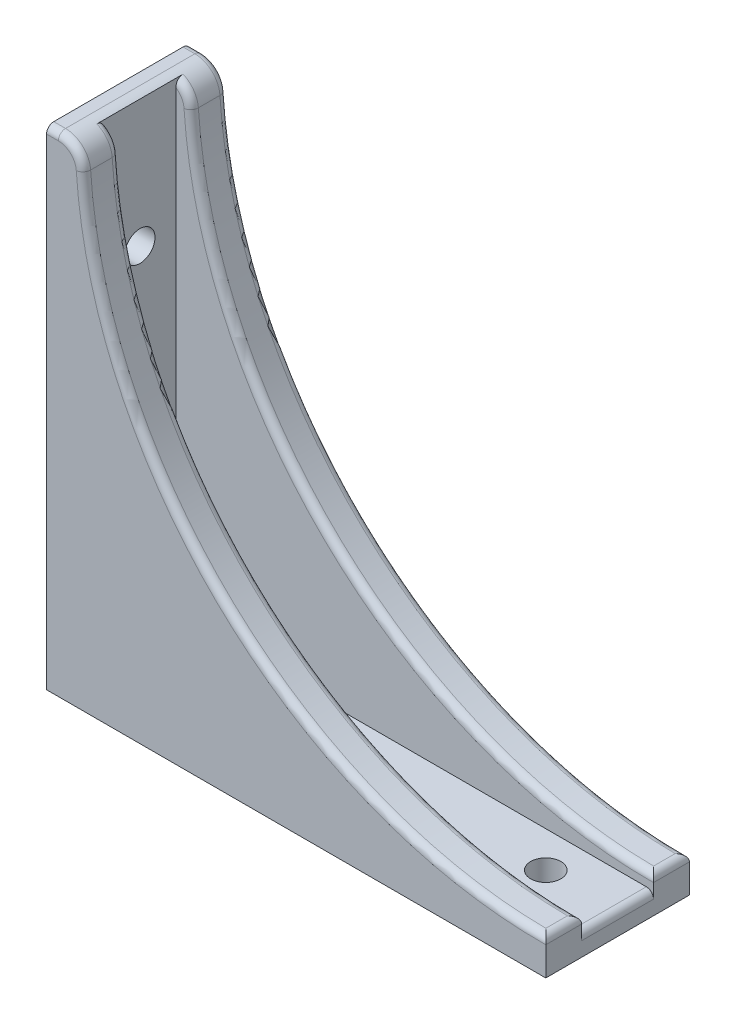
ISO-10303-21;
HEADER;
FILE_DESCRIPTION(('STEP AP214'),'2;1');
FILE_NAME('part.step','',(''),(''),'','','');
FILE_SCHEMA(('AUTOMOTIVE_DESIGN { 1 0 10303 214 1 1 1 1 }'));
ENDSEC;
DATA;
#1=APPLICATION_CONTEXT('core data for automotive mechanical design processes');
#2=APPLICATION_PROTOCOL_DEFINITION('international standard','automotive_design',2000,#1);
#3=PRODUCT_CONTEXT('',#1,'mechanical');
#4=PRODUCT('Part','Part','',(#3));
#5=PRODUCT_RELATED_PRODUCT_CATEGORY('part','',(#4));
#6=PRODUCT_DEFINITION_FORMATION('','',#4);
#7=PRODUCT_DEFINITION_CONTEXT('part definition',#1,'design');
#8=PRODUCT_DEFINITION('design','',#6,#7);
#9=PRODUCT_DEFINITION_SHAPE('','',#8);
#10=(LENGTH_UNIT() NAMED_UNIT(*) SI_UNIT(.MILLI.,.METRE.));
#11=(NAMED_UNIT(*) PLANE_ANGLE_UNIT() SI_UNIT($,.RADIAN.));
#12=(NAMED_UNIT(*) SI_UNIT($,.STERADIAN.) SOLID_ANGLE_UNIT());
#13=UNCERTAINTY_MEASURE_WITH_UNIT(LENGTH_MEASURE(1.E-05),#10,'distance_accuracy_value','');
#14=(GEOMETRIC_REPRESENTATION_CONTEXT(3) GLOBAL_UNCERTAINTY_ASSIGNED_CONTEXT((#13)) GLOBAL_UNIT_ASSIGNED_CONTEXT((#10,
#11,#12)) REPRESENTATION_CONTEXT('',''));
#15=CARTESIAN_POINT('',(0.,0.,0.));
#16=DIRECTION('',(0.,0.,1.));
#17=DIRECTION('',(1.,0.,0.));
#18=AXIS2_PLACEMENT_3D('',#15,#16,#17);
#19=CARTESIAN_POINT('',(0.,68.,20.));
#20=DIRECTION('',(0.,1.,0.));
#21=DIRECTION('',(0.,0.,1.));
#22=AXIS2_PLACEMENT_3D('',#19,#20,#21);
#23=PLANE('',#22);
#24=DIRECTION('',(0.,0.,-1.));
#25=VECTOR('',#24,1.);
#26=CARTESIAN_POINT('',(1.64235406117368,68.,0.));
#27=LINE('',#26,#25);
#28=CARTESIAN_POINT('',(1.64235406117368,68.,19.));
#29=VERTEX_POINT('',#28);
#30=CARTESIAN_POINT('',(1.64235406117368,68.,1.));
#31=VERTEX_POINT('',#30);
#32=EDGE_CURVE('E247',#29,#31,#27,.T.);
#33=ORIENTED_EDGE('',*,*,#32,.T.);
#34=DIRECTION('',(1.,0.,0.));
#35=VECTOR('',#34,1.);
#36=CARTESIAN_POINT('',(0.,68.,1.));
#37=LINE('',#36,#35);
#38=CARTESIAN_POINT('',(0.,68.,1.));
#39=VERTEX_POINT('',#38);
#40=EDGE_CURVE('E291',#31,#39,#37,.F.);
#41=ORIENTED_EDGE('',*,*,#40,.T.);
#42=DIRECTION('',(0.,0.,-1.));
#43=VECTOR('',#42,1.);
#44=CARTESIAN_POINT('',(0.,68.,20.));
#45=LINE('',#44,#43);
#46=CARTESIAN_POINT('',(0.,68.,19.));
#47=VERTEX_POINT('',#46);
#48=EDGE_CURVE('E207',#47,#39,#45,.T.);
#49=ORIENTED_EDGE('',*,*,#48,.F.);
#50=DIRECTION('',(1.,0.,0.));
#51=VECTOR('',#50,1.);
#52=CARTESIAN_POINT('',(0.,68.,19.));
#53=LINE('',#52,#51);
#54=EDGE_CURVE('E287',#47,#29,#53,.T.);
#55=ORIENTED_EDGE('',*,*,#54,.T.);
#56=EDGE_LOOP('',(#33,#41,#49,#55));
#57=FACE_BOUND('',#56,.T.);
#58=ADVANCED_FACE('F45',(#57),#23,.T.);
#59=CARTESIAN_POINT('',(0.,0.,20.));
#60=DIRECTION('',(-1.,0.,0.));
#61=DIRECTION('',(0.,0.,1.));
#62=AXIS2_PLACEMENT_3D('',#59,#60,#61);
#63=PLANE('',#62);
#64=CARTESIAN_POINT('',(0.,25.,10.));
#65=DIRECTION('',(-1.,0.,0.));
#66=DIRECTION('',(0.,0.,1.));
#67=AXIS2_PLACEMENT_3D('',#64,#65,#66);
#68=CIRCLE('',#67,2.1);
#69=CARTESIAN_POINT('',(0.,25.,12.1));
#70=VERTEX_POINT('',#69);
#71=EDGE_CURVE('E830',#70,#70,#68,.T.);
#72=ORIENTED_EDGE('',*,*,#71,.F.);
#73=EDGE_LOOP('',(#72));
#74=FACE_BOUND('',#73,.T.);
#75=CARTESIAN_POINT('',(0.,50.,10.));
#76=DIRECTION('',(-1.,0.,0.));
#77=DIRECTION('',(0.,0.,1.));
#78=AXIS2_PLACEMENT_3D('',#75,#76,#77);
#79=CIRCLE('',#78,2.1);
#80=CARTESIAN_POINT('',(0.,50.,12.1));
#81=VERTEX_POINT('',#80);
#82=EDGE_CURVE('E844',#81,#81,#79,.T.);
#83=ORIENTED_EDGE('',*,*,#82,.F.);
#84=EDGE_LOOP('',(#83));
#85=FACE_BOUND('',#84,.T.);
#86=ORIENTED_EDGE('',*,*,#48,.T.);
#87=CARTESIAN_POINT('',(0.,67.,1.));
#88=DIRECTION('',(-1.,0.,0.));
#89=DIRECTION('',(0.,0.,1.));
#90=AXIS2_PLACEMENT_3D('',#87,#88,#89);
#91=CIRCLE('',#90,1.);
#92=CARTESIAN_POINT('',(0.,67.,0.));
#93=VERTEX_POINT('',#92);
#94=EDGE_CURVE('E297',#39,#93,#91,.T.);
#95=ORIENTED_EDGE('',*,*,#94,.T.);
#96=DIRECTION('',(0.,1.,0.));
#97=VECTOR('',#96,1.);
#98=CARTESIAN_POINT('',(0.,0.,0.));
#99=LINE('',#98,#97);
#100=CARTESIAN_POINT('',(0.,0.,0.));
#101=VERTEX_POINT('',#100);
#102=EDGE_CURVE('E203',#101,#93,#99,.T.);
#103=ORIENTED_EDGE('',*,*,#102,.F.);
#104=DIRECTION('',(0.,0.,-1.));
#105=VECTOR('',#104,1.);
#106=CARTESIAN_POINT('',(0.,0.,20.));
#107=LINE('',#106,#105);
#108=CARTESIAN_POINT('',(0.,0.,20.));
#109=VERTEX_POINT('',#108);
#110=EDGE_CURVE('E195',#109,#101,#107,.T.);
#111=ORIENTED_EDGE('',*,*,#110,.F.);
#112=DIRECTION('',(0.,1.,0.));
#113=VECTOR('',#112,1.);
#114=CARTESIAN_POINT('',(0.,0.,20.));
#115=LINE('',#114,#113);
#116=CARTESIAN_POINT('',(0.,67.,20.));
#117=VERTEX_POINT('',#116);
#118=EDGE_CURVE('E200',#109,#117,#115,.T.);
#119=ORIENTED_EDGE('',*,*,#118,.T.);
#120=CARTESIAN_POINT('',(0.,67.,19.));
#121=DIRECTION('',(-1.,0.,0.));
#122=DIRECTION('',(0.,0.,1.));
#123=AXIS2_PLACEMENT_3D('',#120,#121,#122);
#124=CIRCLE('',#123,1.);
#125=EDGE_CURVE('E294',#117,#47,#124,.T.);
#126=ORIENTED_EDGE('',*,*,#125,.T.);
#127=EDGE_LOOP('',(#86,#95,#103,#111,#119,#126));
#128=FACE_BOUND('',#127,.T.);
#129=ADVANCED_FACE('F198',(#74,#85,#128),#63,.T.);
#130=CARTESIAN_POINT('',(0.,0.,20.));
#131=DIRECTION('',(0.,1.,0.));
#132=DIRECTION('',(0.,0.,1.));
#133=AXIS2_PLACEMENT_3D('',#130,#131,#132);
#134=PLANE('',#133);
#135=CARTESIAN_POINT('',(59.5,0.,10.));
#136=DIRECTION('',(0.,-1.,0.));
#137=DIRECTION('',(0.,0.,-1.));
#138=AXIS2_PLACEMENT_3D('',#135,#136,#137);
#139=CIRCLE('',#138,2.1);
#140=CARTESIAN_POINT('',(59.5,0.,7.9));
#141=VERTEX_POINT('',#140);
#142=EDGE_CURVE('E820',#141,#141,#139,.T.);
#143=ORIENTED_EDGE('',*,*,#142,.F.);
#144=EDGE_LOOP('',(#143));
#145=FACE_BOUND('',#144,.T.);
#146=DIRECTION('',(1.,0.,0.));
#147=VECTOR('',#146,1.);
#148=CARTESIAN_POINT('',(0.,0.,0.));
#149=LINE('',#148,#147);
#150=CARTESIAN_POINT('',(69.5,0.,0.));
#151=VERTEX_POINT('',#150);
#152=EDGE_CURVE('E239',#101,#151,#149,.T.);
#153=ORIENTED_EDGE('',*,*,#152,.T.);
#154=DIRECTION('',(0.,0.,-1.));
#155=VECTOR('',#154,1.);
#156=CARTESIAN_POINT('',(69.5,0.,20.));
#157=LINE('',#156,#155);
#158=CARTESIAN_POINT('',(69.5,0.,20.));
#159=VERTEX_POINT('',#158);
#160=EDGE_CURVE('E208',#159,#151,#157,.T.);
#161=ORIENTED_EDGE('',*,*,#160,.F.);
#162=DIRECTION('',(1.,0.,0.));
#163=VECTOR('',#162,1.);
#164=CARTESIAN_POINT('',(0.,0.,20.));
#165=LINE('',#164,#163);
#166=EDGE_CURVE('E211',#109,#159,#165,.T.);
#167=ORIENTED_EDGE('',*,*,#166,.F.);
#168=ORIENTED_EDGE('',*,*,#110,.T.);
#169=EDGE_LOOP('',(#153,#161,#167,#168));
#170=FACE_BOUND('',#169,.T.);
#171=ADVANCED_FACE('F212',(#145,#170),#134,.F.);
#172=CARTESIAN_POINT('',(69.5,0.,20.));
#173=DIRECTION('',(-1.,0.,0.));
#174=DIRECTION('',(0.,0.,1.));
#175=AXIS2_PLACEMENT_3D('',#172,#173,#174);
#176=PLANE('',#175);
#177=DIRECTION('',(0.,1.,0.));
#178=VECTOR('',#177,1.);
#179=CARTESIAN_POINT('',(69.5,0.,0.));
#180=LINE('',#179,#178);
#181=CARTESIAN_POINT('',(69.5,4.00186347337111,0.));
#182=VERTEX_POINT('',#181);
#183=EDGE_CURVE('E224',#151,#182,#180,.T.);
#184=ORIENTED_EDGE('',*,*,#183,.T.);
#185=DIRECTION('',(0.,0.,1.));
#186=VECTOR('',#185,1.);
#187=CARTESIAN_POINT('',(69.5,4.00186347337111,20.));
#188=LINE('',#187,#186);
#189=CARTESIAN_POINT('',(69.5,4.00186347337111,5.));
#190=VERTEX_POINT('',#189);
#191=EDGE_CURVE('E349',#182,#190,#188,.T.);
#192=ORIENTED_EDGE('',*,*,#191,.T.);
#193=DIRECTION('',(0.,1.,0.));
#194=VECTOR('',#193,1.);
#195=CARTESIAN_POINT('',(69.5,0.,5.));
#196=LINE('',#195,#194);
#197=CARTESIAN_POINT('',(69.5,2.,5.));
#198=VERTEX_POINT('',#197);
#199=EDGE_CURVE('E592',#198,#190,#196,.T.);
#200=ORIENTED_EDGE('',*,*,#199,.F.);
#201=DIRECTION('',(0.,0.,-1.));
#202=VECTOR('',#201,1.);
#203=CARTESIAN_POINT('',(69.5,2.,20.));
#204=LINE('',#203,#202);
#205=CARTESIAN_POINT('',(69.5,2.,15.));
#206=VERTEX_POINT('',#205);
#207=EDGE_CURVE('E342',#198,#206,#204,.F.);
#208=ORIENTED_EDGE('',*,*,#207,.T.);
#209=DIRECTION('',(0.,1.,0.));
#210=VECTOR('',#209,1.);
#211=CARTESIAN_POINT('',(69.5,0.,15.));
#212=LINE('',#211,#210);
#213=CARTESIAN_POINT('',(69.5,4.00186347337111,15.));
#214=VERTEX_POINT('',#213);
#215=EDGE_CURVE('E231',#206,#214,#212,.T.);
#216=ORIENTED_EDGE('',*,*,#215,.T.);
#217=DIRECTION('',(0.,0.,1.));
#218=VECTOR('',#217,1.);
#219=CARTESIAN_POINT('',(69.5,4.00186347337111,20.));
#220=LINE('',#219,#218);
#221=CARTESIAN_POINT('',(69.5,4.00186347337111,20.));
#222=VERTEX_POINT('',#221);
#223=EDGE_CURVE('E346',#214,#222,#220,.T.);
#224=ORIENTED_EDGE('',*,*,#223,.T.);
#225=DIRECTION('',(0.,1.,0.));
#226=VECTOR('',#225,1.);
#227=CARTESIAN_POINT('',(69.5,0.,20.));
#228=LINE('',#227,#226);
#229=EDGE_CURVE('E234',#159,#222,#228,.T.);
#230=ORIENTED_EDGE('',*,*,#229,.F.);
#231=ORIENTED_EDGE('',*,*,#160,.T.);
#232=EDGE_LOOP('',(#184,#192,#200,#208,#216,#224,#230,#231));
#233=FACE_BOUND('',#232,.T.);
#234=ADVANCED_FACE('F401',(#233),#176,.F.);
#235=CARTESIAN_POINT('',(0.,0.,20.));
#236=DIRECTION('',(0.,0.,1.));
#237=DIRECTION('',(1.,0.,0.));
#238=AXIS2_PLACEMENT_3D('',#235,#236,#237);
#239=PLANE('',#238);
#240=CARTESIAN_POINT('',(1.64235406117368,64.5,20.));
#241=DIRECTION('',(0.,0.,1.));
#242=DIRECTION('',(1.,0.,0.));
#243=AXIS2_PLACEMENT_3D('',#240,#241,#242);
#244=CIRCLE('',#243,2.5);
#245=CARTESIAN_POINT('',(4.13679231902297,64.6666666666667,20.));
#246=VERTEX_POINT('',#245);
#247=CARTESIAN_POINT('',(1.64235406117368,67.,20.));
#248=VERTEX_POINT('',#247);
#249=EDGE_CURVE('E316',#246,#248,#244,.T.);
#250=ORIENTED_EDGE('',*,*,#249,.T.);
#251=DIRECTION('',(1.,0.,0.));
#252=VECTOR('',#251,1.);
#253=CARTESIAN_POINT('',(0.,67.,20.));
#254=LINE('',#253,#252);
#255=EDGE_CURVE('E222',#248,#117,#254,.F.);
#256=ORIENTED_EDGE('',*,*,#255,.T.);
#257=ORIENTED_EDGE('',*,*,#118,.F.);
#258=ORIENTED_EDGE('',*,*,#166,.T.);
#259=ORIENTED_EDGE('',*,*,#229,.T.);
#260=CARTESIAN_POINT('',(69.5,4.0019836765729,20.));
#261=VERTEX_POINT('',#260);
#262=EDGE_CURVE('E218',#222,#261,#228,.T.);
#263=ORIENTED_EDGE('',*,*,#262,.T.);
#264=CARTESIAN_POINT('',(68.9921870231046,69.,20.));
#265=DIRECTION('',(0.,0.,1.));
#266=DIRECTION('',(1.,0.,0.));
#267=AXIS2_PLACEMENT_3D('',#264,#265,#266);
#268=CIRCLE('',#267,65.);
#269=EDGE_CURVE('E313',#261,#246,#268,.F.);
#270=ORIENTED_EDGE('',*,*,#269,.T.);
#271=EDGE_LOOP('',(#250,#256,#257,#258,#259,#263,#270));
#272=FACE_BOUND('',#271,.T.);
#273=ADVANCED_FACE('F220',(#272),#239,.T.);
#274=CARTESIAN_POINT('',(0.,0.,0.));
#275=DIRECTION('',(0.,0.,1.));
#276=DIRECTION('',(1.,0.,0.));
#277=AXIS2_PLACEMENT_3D('',#274,#275,#276);
#278=PLANE('',#277);
#279=ORIENTED_EDGE('',*,*,#102,.T.);
#280=DIRECTION('',(1.,0.,0.));
#281=VECTOR('',#280,1.);
#282=CARTESIAN_POINT('',(1.64235406117368,67.,0.));
#283=LINE('',#282,#281);
#284=CARTESIAN_POINT('',(1.64235406117368,67.,0.));
#285=VERTEX_POINT('',#284);
#286=EDGE_CURVE('E283',#93,#285,#283,.T.);
#287=ORIENTED_EDGE('',*,*,#286,.T.);
#288=CARTESIAN_POINT('',(1.64235406117368,64.5,0.));
#289=DIRECTION('',(0.,0.,1.));
#290=DIRECTION('',(1.,0.,0.));
#291=AXIS2_PLACEMENT_3D('',#288,#289,#290);
#292=CIRCLE('',#291,2.5);
#293=CARTESIAN_POINT('',(4.13679231902297,64.6666666666667,0.));
#294=VERTEX_POINT('',#293);
#295=EDGE_CURVE('E280',#285,#294,#292,.F.);
#296=ORIENTED_EDGE('',*,*,#295,.T.);
#297=CARTESIAN_POINT('',(68.9921870231046,69.,0.));
#298=DIRECTION('',(0.,0.,1.));
#299=DIRECTION('',(1.,0.,0.));
#300=AXIS2_PLACEMENT_3D('',#297,#298,#299);
#301=CIRCLE('',#300,65.);
#302=CARTESIAN_POINT('',(69.5,4.0019836765729,0.));
#303=VERTEX_POINT('',#302);
#304=EDGE_CURVE('E277',#294,#303,#301,.T.);
#305=ORIENTED_EDGE('',*,*,#304,.T.);
#306=EDGE_CURVE('E228',#182,#303,#180,.T.);
#307=ORIENTED_EDGE('',*,*,#306,.F.);
#308=ORIENTED_EDGE('',*,*,#183,.F.);
#309=ORIENTED_EDGE('',*,*,#152,.F.);
#310=EDGE_LOOP('',(#279,#287,#296,#305,#307,#308,#309));
#311=FACE_BOUND('',#310,.T.);
#312=ADVANCED_FACE('F397',(#311),#278,.F.);
#313=CARTESIAN_POINT('',(0.,0.,15.));
#314=DIRECTION('',(0.,0.,1.));
#315=DIRECTION('',(1.,0.,0.));
#316=AXIS2_PLACEMENT_3D('',#313,#314,#315);
#317=PLANE('',#316);
#318=DIRECTION('',(0.,-1.,0.));
#319=VECTOR('',#318,1.);
#320=CARTESIAN_POINT('',(3.,0.,15.));
#321=LINE('',#320,#319);
#322=CARTESIAN_POINT('',(3.,66.5992373626602,15.));
#323=VERTEX_POINT('',#322);
#324=CARTESIAN_POINT('',(3.,6.5,15.));
#325=VERTEX_POINT('',#324);
#326=EDGE_CURVE('E587',#323,#325,#321,.T.);
#327=ORIENTED_EDGE('',*,*,#326,.F.);
#328=CARTESIAN_POINT('',(1.64235406117368,64.5,15.));
#329=DIRECTION('',(0.,0.,1.));
#330=DIRECTION('',(1.,0.,0.));
#331=AXIS2_PLACEMENT_3D('',#328,#329,#330);
#332=CIRCLE('',#331,2.5);
#333=CARTESIAN_POINT('',(4.13679231902297,64.6666666666667,15.));
#334=VERTEX_POINT('',#333);
#335=EDGE_CURVE('E324',#323,#334,#332,.F.);
#336=ORIENTED_EDGE('',*,*,#335,.T.);
#337=CARTESIAN_POINT('',(68.9921870231046,69.,15.));
#338=DIRECTION('',(0.,0.,1.));
#339=DIRECTION('',(1.,0.,0.));
#340=AXIS2_PLACEMENT_3D('',#337,#338,#339);
#341=CIRCLE('',#340,65.);
#342=CARTESIAN_POINT('',(69.5,4.0019836765729,15.));
#343=VERTEX_POINT('',#342);
#344=EDGE_CURVE('E321',#334,#343,#341,.T.);
#345=ORIENTED_EDGE('',*,*,#344,.T.);
#346=EDGE_CURVE('E591',#214,#343,#212,.T.);
#347=ORIENTED_EDGE('',*,*,#346,.F.);
#348=ORIENTED_EDGE('',*,*,#215,.F.);
#349=CARTESIAN_POINT('',(68.5,2.,15.));
#350=DIRECTION('',(0.,0.,1.));
#351=DIRECTION('',(1.,0.,0.));
#352=AXIS2_PLACEMENT_3D('',#349,#350,#351);
#353=CIRCLE('',#352,1.);
#354=CARTESIAN_POINT('',(68.5,3.,15.));
#355=VERTEX_POINT('',#354);
#356=EDGE_CURVE('E12',#206,#355,#353,.T.);
#357=ORIENTED_EDGE('',*,*,#356,.T.);
#358=DIRECTION('',(-1.,0.,0.));
#359=VECTOR('',#358,1.);
#360=CARTESIAN_POINT('',(0.,3.,15.));
#361=LINE('',#360,#359);
#362=CARTESIAN_POINT('',(6.5,3.,15.));
#363=VERTEX_POINT('',#362);
#364=EDGE_CURVE('E240',#355,#363,#361,.T.);
#365=ORIENTED_EDGE('',*,*,#364,.T.);
#366=CARTESIAN_POINT('',(6.5,6.5,15.));
#367=DIRECTION('',(0.,0.,1.));
#368=DIRECTION('',(1.,0.,0.));
#369=AXIS2_PLACEMENT_3D('',#366,#367,#368);
#370=CIRCLE('',#369,3.5);
#371=EDGE_CURVE('E266',#363,#325,#370,.F.);
#372=ORIENTED_EDGE('',*,*,#371,.T.);
#373=EDGE_LOOP('',(#327,#336,#345,#347,#348,#357,#365,#372));
#374=FACE_BOUND('',#373,.T.);
#375=ADVANCED_FACE('F393',(#374),#317,.F.);
#376=CARTESIAN_POINT('',(0.,3.,112.990590921878));
#377=DIRECTION('',(0.,-1.,0.));
#378=DIRECTION('',(1.,0.,0.));
#379=AXIS2_PLACEMENT_3D('',#376,#377,#378);
#380=PLANE('',#379);
#381=CARTESIAN_POINT('',(59.5,3.,10.));
#382=DIRECTION('',(0.,-1.,0.));
#383=DIRECTION('',(1.,0.,0.));
#384=AXIS2_PLACEMENT_3D('',#381,#382,#383);
#385=CIRCLE('',#384,2.1);
#386=CARTESIAN_POINT('',(61.6,3.,10.));
#387=VERTEX_POINT('',#386);
#388=EDGE_CURVE('E823',#387,#387,#385,.F.);
#389=ORIENTED_EDGE('',*,*,#388,.F.);
#390=EDGE_LOOP('',(#389));
#391=FACE_BOUND('',#390,.T.);
#392=ORIENTED_EDGE('',*,*,#364,.F.);
#393=DIRECTION('',(0.,0.,-1.));
#394=VECTOR('',#393,1.);
#395=CARTESIAN_POINT('',(68.5,3.,112.990590921878));
#396=LINE('',#395,#394);
#397=CARTESIAN_POINT('',(68.5,3.,5.));
#398=VERTEX_POINT('',#397);
#399=EDGE_CURVE('E359',#355,#398,#396,.T.);
#400=ORIENTED_EDGE('',*,*,#399,.T.);
#401=DIRECTION('',(-1.,0.,0.));
#402=VECTOR('',#401,1.);
#403=CARTESIAN_POINT('',(0.,3.,5.));
#404=LINE('',#403,#402);
#405=CARTESIAN_POINT('',(6.5,3.,5.));
#406=VERTEX_POINT('',#405);
#407=EDGE_CURVE('E828',#398,#406,#404,.T.);
#408=ORIENTED_EDGE('',*,*,#407,.T.);
#409=DIRECTION('',(0.,0.,-1.));
#410=VECTOR('',#409,1.);
#411=CARTESIAN_POINT('',(6.5,3.,112.990590921878));
#412=LINE('',#411,#410);
#413=EDGE_CURVE('E273',#406,#363,#412,.F.);
#414=ORIENTED_EDGE('',*,*,#413,.T.);
#415=EDGE_LOOP('',(#392,#400,#408,#414));
#416=FACE_BOUND('',#415,.T.);
#417=ADVANCED_FACE('F387',(#391,#416),#380,.F.);
#418=CARTESIAN_POINT('',(3.,0.,112.990590921878));
#419=DIRECTION('',(1.,0.,0.));
#420=DIRECTION('',(0.,1.,0.));
#421=AXIS2_PLACEMENT_3D('',#418,#419,#420);
#422=PLANE('',#421);
#423=CARTESIAN_POINT('',(3.,25.,10.));
#424=DIRECTION('',(1.,0.,0.));
#425=DIRECTION('',(0.,1.,0.));
#426=AXIS2_PLACEMENT_3D('',#423,#424,#425);
#427=CIRCLE('',#426,2.1);
#428=CARTESIAN_POINT('',(3.,27.1,10.));
#429=VERTEX_POINT('',#428);
#430=EDGE_CURVE('E847',#429,#429,#427,.F.);
#431=ORIENTED_EDGE('',*,*,#430,.T.);
#432=EDGE_LOOP('',(#431));
#433=FACE_BOUND('',#432,.T.);
#434=CARTESIAN_POINT('',(3.,50.,10.));
#435=DIRECTION('',(1.,0.,0.));
#436=DIRECTION('',(0.,1.,0.));
#437=AXIS2_PLACEMENT_3D('',#434,#435,#436);
#438=CIRCLE('',#437,2.1);
#439=CARTESIAN_POINT('',(3.,52.1,10.));
#440=VERTEX_POINT('',#439);
#441=EDGE_CURVE('E841',#440,#440,#438,.F.);
#442=ORIENTED_EDGE('',*,*,#441,.T.);
#443=EDGE_LOOP('',(#442));
#444=FACE_BOUND('',#443,.T.);
#445=DIRECTION('',(0.,-1.,0.));
#446=VECTOR('',#445,1.);
#447=CARTESIAN_POINT('',(3.,0.,5.));
#448=LINE('',#447,#446);
#449=CARTESIAN_POINT('',(3.,66.5992373626602,5.));
#450=VERTEX_POINT('',#449);
#451=CARTESIAN_POINT('',(3.,6.5,5.));
#452=VERTEX_POINT('',#451);
#453=EDGE_CURVE('E548',#450,#452,#448,.T.);
#454=ORIENTED_EDGE('',*,*,#453,.F.);
#455=CARTESIAN_POINT('',(3.,66.5992373626602,5.));
#456=CARTESIAN_POINT('',(3.,66.6349871569427,4.999998688695));
#457=CARTESIAN_POINT('',(3.,66.6707279069903,4.9986469732193));
#458=CARTESIAN_POINT('',(3.,66.742017571314,4.99312512695188));
#459=CARTESIAN_POINT('',(3.,66.7775663126024,4.98895278030735));
#460=CARTESIAN_POINT('',(3.,66.8839673745247,4.97196914758167));
#461=CARTESIAN_POINT('',(3.,66.9541767009538,4.95468853797339));
#462=CARTESIAN_POINT('',(3.,67.0906990364526,4.90764515244601));
#463=CARTESIAN_POINT('',(3.,67.1569911914552,4.87782142371657));
#464=CARTESIAN_POINT('',(3.,67.2823649060175,4.80587760505351));
#465=CARTESIAN_POINT('',(3.,67.3414683129403,4.76379616203851));
#466=CARTESIAN_POINT('',(3.,67.4425398621382,4.67459479942204));
#467=CARTESIAN_POINT('',(3.,67.4857396014429,4.6288686001065));
#468=CARTESIAN_POINT('',(3.,67.5627611873379,4.53002448431719));
#469=CARTESIAN_POINT('',(3.,67.5965813711852,4.47690525976214));
#470=CARTESIAN_POINT('',(3.,67.6501482093724,4.37107230820072));
#471=CARTESIAN_POINT('',(3.,67.6710115828613,4.3189202507046));
#472=CARTESIAN_POINT('',(3.,67.703044498347,4.21177972463966));
#473=CARTESIAN_POINT('',(3.,67.714235301784,4.15679776008333));
#474=CARTESIAN_POINT('',(3.,67.7222331429399,4.08450452971614));
#475=CARTESIAN_POINT('',(3.,67.7236299107036,4.06762050812165));
#476=CARTESIAN_POINT('',(3.,67.7254904121707,4.03382691010417));
#477=CARTESIAN_POINT('',(3.,67.7259555642274,4.01691741181243));
#478=CARTESIAN_POINT('',(3.,67.7259568355433,4.));
#479=B_SPLINE_CURVE_WITH_KNOTS('',3,(#455,#456,#457,#458,#459,#460,#461,#462,#463,#464,#465,
#466,#467,#468,#469,#470,#471,#472,#473,#474,#475,#476,#477,#478),.UNSPECIFIED.,.F.,.F.,(4,2,2,
2,2,2,2,2,2,2,2,4),(0.,0.107200291124805,0.214484895480606,0.430233642122913,0.647043151579606,
0.863176355092028,1.05084139852214,1.23853968868651,1.40620748786015,1.57350578942851,
1.62431323849938,1.67504327597388),.UNSPECIFIED.);
#480=CARTESIAN_POINT('',(3.,67.7259568355433,4.));
#481=VERTEX_POINT('',#480);
#482=EDGE_CURVE('E371',#450,#481,#479,.T.);
#483=ORIENTED_EDGE('',*,*,#482,.T.);
#484=DIRECTION('',(0.,0.,1.));
#485=VECTOR('',#484,1.);
#486=CARTESIAN_POINT('',(3.,67.7259568355433,5.));
#487=LINE('',#486,#485);
#488=CARTESIAN_POINT('',(3.,67.7259568355433,16.));
#489=VERTEX_POINT('',#488);
#490=EDGE_CURVE('E263',#481,#489,#487,.T.);
#491=ORIENTED_EDGE('',*,*,#490,.T.);
#492=CARTESIAN_POINT('',(3.,67.7259568355433,16.));
#493=CARTESIAN_POINT('',(3.,67.7259574488045,15.9735986482976));
#494=CARTESIAN_POINT('',(3.,67.7248216837337,15.9472103883409));
#495=CARTESIAN_POINT('',(3.,67.7202961376286,15.8946321701312));
#496=CARTESIAN_POINT('',(3.,67.7169067266048,15.8684421800395));
#497=CARTESIAN_POINT('',(3.,67.7034159524552,15.7905900455414));
#498=CARTESIAN_POINT('',(3.,67.6899917514636,15.7394654963516));
#499=CARTESIAN_POINT('',(3.,67.6547807252862,15.6402272139827));
#500=CARTESIAN_POINT('',(3.,67.632994607785,15.5921132264149));
#501=CARTESIAN_POINT('',(3.,67.5818390231414,15.5000889822292));
#502=CARTESIAN_POINT('',(3.,67.5524670188342,15.4561801388062));
#503=CARTESIAN_POINT('',(3.,67.4863138402108,15.3725554050557));
#504=CARTESIAN_POINT('',(3.,67.4493652801015,15.3329723349451));
#505=CARTESIAN_POINT('',(3.,67.3697547779363,15.2600836790625));
#506=CARTESIAN_POINT('',(3.,67.3270930333073,15.2267778764667));
#507=CARTESIAN_POINT('',(3.,67.2340753771067,15.1647690082163));
#508=CARTESIAN_POINT('',(3.,67.1833874309911,15.1365653006215));
#509=CARTESIAN_POINT('',(3.,67.0782872242775,15.0881060508074));
#510=CARTESIAN_POINT('',(3.,67.0238696473004,15.0678621436741));
#511=CARTESIAN_POINT('',(3.,66.9083981297407,15.0340439134105));
#512=CARTESIAN_POINT('',(3.,66.8471577962454,15.0211138649335));
#513=CARTESIAN_POINT('',(3.,66.723653495114,15.0040873043788));
#514=CARTESIAN_POINT('',(3.,66.6613935834326,14.9999617147305));
#515=CARTESIAN_POINT('',(3.,66.5992373626602,15.));
#516=B_SPLINE_CURVE_WITH_KNOTS('',3,(#492,#493,#494,#495,#496,#497,#498,#499,#500,#501,#502,
#503,#504,#505,#506,#507,#508,#509,#510,#511,#512,#513,#514,#515),.UNSPECIFIED.,.F.,.F.,(4,2,2,
2,2,2,2,2,2,2,2,4),(0.,0.0791538533697612,0.158294714225698,0.316042813257944,0.47377756471796,
0.631565140390746,0.793311064872973,0.955051401442134,1.12835608191097,1.30191315371352,
1.48902327111208,1.67551447692544),.UNSPECIFIED.);
#517=EDGE_CURVE('E363',#489,#323,#516,.T.);
#518=ORIENTED_EDGE('',*,*,#517,.T.);
#519=ORIENTED_EDGE('',*,*,#326,.T.);
#520=DIRECTION('',(0.,0.,-1.));
#521=VECTOR('',#520,1.);
#522=CARTESIAN_POINT('',(3.,6.5,112.990590921878));
#523=LINE('',#522,#521);
#524=EDGE_CURVE('E259',#325,#452,#523,.T.);
#525=ORIENTED_EDGE('',*,*,#524,.T.);
#526=EDGE_LOOP('',(#454,#483,#491,#518,#519,#525));
#527=FACE_BOUND('',#526,.T.);
#528=ADVANCED_FACE('F381',(#433,#444,#527),#422,.T.);
#529=CARTESIAN_POINT('',(0.,0.,5.));
#530=DIRECTION('',(0.,0.,1.));
#531=DIRECTION('',(1.,0.,0.));
#532=AXIS2_PLACEMENT_3D('',#529,#530,#531);
#533=PLANE('',#532);
#534=CARTESIAN_POINT('',(68.9921870231046,69.,5.));
#535=DIRECTION('',(0.,0.,1.));
#536=DIRECTION('',(1.,0.,0.));
#537=AXIS2_PLACEMENT_3D('',#534,#535,#536);
#538=CIRCLE('',#537,65.);
#539=CARTESIAN_POINT('',(69.5,4.0019836765729,5.));
#540=VERTEX_POINT('',#539);
#541=CARTESIAN_POINT('',(4.13679231902297,64.6666666666667,5.));
#542=VERTEX_POINT('',#541);
#543=EDGE_CURVE('E327',#540,#542,#538,.F.);
#544=ORIENTED_EDGE('',*,*,#543,.T.);
#545=CARTESIAN_POINT('',(1.64235406117368,64.5,5.));
#546=DIRECTION('',(0.,0.,1.));
#547=DIRECTION('',(1.,0.,0.));
#548=AXIS2_PLACEMENT_3D('',#545,#546,#547);
#549=CIRCLE('',#548,2.5);
#550=EDGE_CURVE('E330',#542,#450,#549,.T.);
#551=ORIENTED_EDGE('',*,*,#550,.T.);
#552=ORIENTED_EDGE('',*,*,#453,.T.);
#553=CARTESIAN_POINT('',(6.5,6.5,5.));
#554=DIRECTION('',(0.,0.,1.));
#555=DIRECTION('',(1.,0.,0.));
#556=AXIS2_PLACEMENT_3D('',#553,#554,#555);
#557=CIRCLE('',#556,3.5);
#558=EDGE_CURVE('E255',#452,#406,#557,.T.);
#559=ORIENTED_EDGE('',*,*,#558,.T.);
#560=ORIENTED_EDGE('',*,*,#407,.F.);
#561=CARTESIAN_POINT('',(68.5,2.,5.));
#562=DIRECTION('',(0.,0.,1.));
#563=DIRECTION('',(1.,0.,0.));
#564=AXIS2_PLACEMENT_3D('',#561,#562,#563);
#565=CIRCLE('',#564,1.);
#566=EDGE_CURVE('E55',#398,#198,#565,.F.);
#567=ORIENTED_EDGE('',*,*,#566,.T.);
#568=ORIENTED_EDGE('',*,*,#199,.T.);
#569=EDGE_CURVE('E596',#190,#540,#196,.T.);
#570=ORIENTED_EDGE('',*,*,#569,.T.);
#571=EDGE_LOOP('',(#544,#551,#552,#559,#560,#567,#568,#570));
#572=FACE_BOUND('',#571,.T.);
#573=ADVANCED_FACE('F386',(#572),#533,.T.);
#574=CARTESIAN_POINT('',(59.5,68.001,10.));
#575=DIRECTION('',(0.,-1.,0.));
#576=DIRECTION('',(0.,0.,-1.));
#577=AXIS2_PLACEMENT_3D('',#574,#575,#576);
#578=CYLINDRICAL_SURFACE('',#577,2.1);
#579=ORIENTED_EDGE('',*,*,#142,.T.);
#580=EDGE_LOOP('',(#579));
#581=FACE_BOUND('',#580,.T.);
#582=ORIENTED_EDGE('',*,*,#388,.T.);
#583=EDGE_LOOP('',(#582));
#584=FACE_BOUND('',#583,.T.);
#585=ADVANCED_FACE('F706',(#581,#584),#578,.F.);
#586=CARTESIAN_POINT('',(69.501,50.,10.));
#587=DIRECTION('',(-1.,0.,0.));
#588=DIRECTION('',(0.,0.,1.));
#589=AXIS2_PLACEMENT_3D('',#586,#587,#588);
#590=CYLINDRICAL_SURFACE('',#589,2.1);
#591=ORIENTED_EDGE('',*,*,#441,.F.);
#592=EDGE_LOOP('',(#591));
#593=FACE_BOUND('',#592,.T.);
#594=ORIENTED_EDGE('',*,*,#82,.T.);
#595=EDGE_LOOP('',(#594));
#596=FACE_BOUND('',#595,.T.);
#597=ADVANCED_FACE('F776',(#593,#596),#590,.F.);
#598=CARTESIAN_POINT('',(69.501,25.,10.));
#599=DIRECTION('',(-1.,0.,0.));
#600=DIRECTION('',(0.,0.,1.));
#601=AXIS2_PLACEMENT_3D('',#598,#599,#600);
#602=CYLINDRICAL_SURFACE('',#601,2.1);
#603=ORIENTED_EDGE('',*,*,#430,.F.);
#604=EDGE_LOOP('',(#603));
#605=FACE_BOUND('',#604,.T.);
#606=ORIENTED_EDGE('',*,*,#71,.T.);
#607=EDGE_LOOP('',(#606));
#608=FACE_BOUND('',#607,.T.);
#609=ADVANCED_FACE('F421',(#605,#608),#602,.F.);
#610=CARTESIAN_POINT('',(68.9921870231046,69.,20.));
#611=DIRECTION('',(0.,0.,1.));
#612=DIRECTION('',(1.,0.,0.));
#613=AXIS2_PLACEMENT_3D('',#610,#611,#612);
#614=CYLINDRICAL_SURFACE('',#613,64.);
#615=DIRECTION('',(0.,0.,1.));
#616=VECTOR('',#615,1.);
#617=CARTESIAN_POINT('',(5.13456762216269,64.7333333333333,17.5));
#618=LINE('',#617,#616);
#619=CARTESIAN_POINT('',(5.13456762216269,64.7333333333333,16.));
#620=VERTEX_POINT('',#619);
#621=CARTESIAN_POINT('',(5.13456762216269,64.7333333333333,19.));
#622=VERTEX_POINT('',#621);
#623=EDGE_CURVE('E270',#620,#622,#618,.T.);
#624=ORIENTED_EDGE('',*,*,#623,.T.);
#625=CARTESIAN_POINT('',(68.9921870231046,69.,19.));
#626=DIRECTION('',(0.,0.,1.));
#627=DIRECTION('',(1.,0.,0.));
#628=AXIS2_PLACEMENT_3D('',#625,#626,#627);
#629=CIRCLE('',#628,64.);
#630=CARTESIAN_POINT('',(68.5075721080478,5.00183480455002,19.));
#631=VERTEX_POINT('',#630);
#632=EDGE_CURVE('E63',#622,#631,#629,.T.);
#633=ORIENTED_EDGE('',*,*,#632,.T.);
#634=DIRECTION('',(0.,0.,1.));
#635=VECTOR('',#634,1.);
#636=CARTESIAN_POINT('',(68.5075721080478,5.00183480455002,20.));
#637=LINE('',#636,#635);
#638=CARTESIAN_POINT('',(68.5075721080478,5.00183480455003,16.));
#639=VERTEX_POINT('',#638);
#640=EDGE_CURVE('E67',#631,#639,#637,.F.);
#641=ORIENTED_EDGE('',*,*,#640,.T.);
#642=CARTESIAN_POINT('',(68.9921870231046,69.,16.));
#643=DIRECTION('',(0.,0.,1.));
#644=DIRECTION('',(1.,0.,0.));
#645=AXIS2_PLACEMENT_3D('',#642,#643,#644);
#646=CIRCLE('',#645,64.);
#647=EDGE_CURVE('E352',#639,#620,#646,.F.);
#648=ORIENTED_EDGE('',*,*,#647,.T.);
#649=EDGE_LOOP('',(#624,#633,#641,#648));
#650=FACE_BOUND('',#649,.T.);
#651=ADVANCED_FACE('F417',(#650),#614,.F.);
#652=CARTESIAN_POINT('',(68.9921870231046,69.,5.));
#653=DIRECTION('',(0.,0.,1.));
#654=DIRECTION('',(1.,0.,0.));
#655=AXIS2_PLACEMENT_3D('',#652,#653,#654);
#656=CYLINDRICAL_SURFACE('',#655,64.);
#657=DIRECTION('',(0.,0.,1.));
#658=VECTOR('',#657,1.);
#659=CARTESIAN_POINT('',(68.5075721080478,5.00183480455002,5.));
#660=LINE('',#659,#658);
#661=CARTESIAN_POINT('',(68.5075721080478,5.00183480455003,4.));
#662=VERTEX_POINT('',#661);
#663=CARTESIAN_POINT('',(68.5075721080478,5.00183480455002,1.));
#664=VERTEX_POINT('',#663);
#665=EDGE_CURVE('E336',#662,#664,#660,.F.);
#666=ORIENTED_EDGE('',*,*,#665,.T.);
#667=CARTESIAN_POINT('',(68.9921870231046,69.,1.));
#668=DIRECTION('',(0.,0.,1.));
#669=DIRECTION('',(1.,0.,0.));
#670=AXIS2_PLACEMENT_3D('',#667,#668,#669);
#671=CIRCLE('',#670,64.);
#672=CARTESIAN_POINT('',(5.13456762216269,64.7333333333333,1.));
#673=VERTEX_POINT('',#672);
#674=EDGE_CURVE('E339',#664,#673,#671,.F.);
#675=ORIENTED_EDGE('',*,*,#674,.T.);
#676=DIRECTION('',(0.,0.,1.));
#677=VECTOR('',#676,1.);
#678=CARTESIAN_POINT('',(5.13456762216269,64.7333333333333,5.));
#679=LINE('',#678,#677);
#680=CARTESIAN_POINT('',(5.13456762216269,64.7333333333333,4.));
#681=VERTEX_POINT('',#680);
#682=EDGE_CURVE('E251',#673,#681,#679,.T.);
#683=ORIENTED_EDGE('',*,*,#682,.T.);
#684=CARTESIAN_POINT('',(68.9921870231046,69.,4.));
#685=DIRECTION('',(0.,0.,1.));
#686=DIRECTION('',(1.,0.,0.));
#687=AXIS2_PLACEMENT_3D('',#684,#685,#686);
#688=CIRCLE('',#687,64.);
#689=EDGE_CURVE('E333',#681,#662,#688,.T.);
#690=ORIENTED_EDGE('',*,*,#689,.T.);
#691=EDGE_LOOP('',(#666,#675,#683,#690));
#692=FACE_BOUND('',#691,.T.);
#693=ADVANCED_FACE('F420',(#692),#656,.F.);
#694=CARTESIAN_POINT('',(1.64235406117368,64.5,5.));
#695=DIRECTION('',(0.,0.,1.));
#696=DIRECTION('',(1.,0.,0.));
#697=AXIS2_PLACEMENT_3D('',#694,#695,#696);
#698=CYLINDRICAL_SURFACE('',#697,3.5);
#699=ORIENTED_EDGE('',*,*,#682,.F.);
#700=CARTESIAN_POINT('',(1.64235406117368,64.5,1.));
#701=DIRECTION('',(0.,0.,1.));
#702=DIRECTION('',(1.,0.,0.));
#703=AXIS2_PLACEMENT_3D('',#700,#701,#702);
#704=CIRCLE('',#703,3.5);
#705=EDGE_CURVE('E310',#673,#31,#704,.T.);
#706=ORIENTED_EDGE('',*,*,#705,.T.);
#707=ORIENTED_EDGE('',*,*,#32,.F.);
#708=CARTESIAN_POINT('',(1.64235406117368,64.5,19.));
#709=DIRECTION('',(0.,0.,1.));
#710=DIRECTION('',(1.,0.,0.));
#711=AXIS2_PLACEMENT_3D('',#708,#709,#710);
#712=CIRCLE('',#711,3.5);
#713=EDGE_CURVE('E307',#29,#622,#712,.F.);
#714=ORIENTED_EDGE('',*,*,#713,.T.);
#715=ORIENTED_EDGE('',*,*,#623,.F.);
#716=CARTESIAN_POINT('',(1.64235406117368,64.5,16.));
#717=DIRECTION('',(0.,0.,1.));
#718=DIRECTION('',(1.,0.,0.));
#719=AXIS2_PLACEMENT_3D('',#716,#717,#718);
#720=CIRCLE('',#719,3.5);
#721=EDGE_CURVE('E303',#620,#489,#720,.T.);
#722=ORIENTED_EDGE('',*,*,#721,.T.);
#723=ORIENTED_EDGE('',*,*,#490,.F.);
#724=CARTESIAN_POINT('',(1.64235406117368,64.5,4.));
#725=DIRECTION('',(0.,0.,1.));
#726=DIRECTION('',(1.,0.,0.));
#727=AXIS2_PLACEMENT_3D('',#724,#725,#726);
#728=CIRCLE('',#727,3.5);
#729=EDGE_CURVE('E300',#481,#681,#728,.F.);
#730=ORIENTED_EDGE('',*,*,#729,.T.);
#731=EDGE_LOOP('',(#699,#706,#707,#714,#715,#722,#723,#730));
#732=FACE_BOUND('',#731,.T.);
#733=ADVANCED_FACE('F424',(#732),#698,.T.);
#734=CARTESIAN_POINT('',(6.5,6.5,112.990590921878));
#735=DIRECTION('',(0.,0.,-1.));
#736=DIRECTION('',(-1.,0.,0.));
#737=AXIS2_PLACEMENT_3D('',#734,#735,#736);
#738=CYLINDRICAL_SURFACE('',#737,3.5);
#739=ORIENTED_EDGE('',*,*,#371,.F.);
#740=ORIENTED_EDGE('',*,*,#413,.F.);
#741=ORIENTED_EDGE('',*,*,#558,.F.);
#742=ORIENTED_EDGE('',*,*,#524,.F.);
#743=EDGE_LOOP('',(#739,#740,#741,#742));
#744=FACE_BOUND('',#743,.T.);
#745=ADVANCED_FACE('F428',(#744),#738,.F.);
#746=CARTESIAN_POINT('',(1.64235406117368,64.5,4.));
#747=DIRECTION('',(0.,0.,1.));
#748=DIRECTION('',(1.,0.,0.));
#749=AXIS2_PLACEMENT_3D('',#746,#747,#748);
#750=TOROIDAL_SURFACE('',#749,2.5,1.);
#751=ORIENTED_EDGE('',*,*,#482,.F.);
#752=ORIENTED_EDGE('',*,*,#550,.F.);
#753=CARTESIAN_POINT('',(4.13679231902297,64.6666666666667,4.));
#754=DIRECTION('',(0.0666666666666732,-0.997775303139717,0.));
#755=DIRECTION('',(0.997775303139717,0.0666666666666732,0.));
#756=AXIS2_PLACEMENT_3D('',#753,#754,#755);
#757=CIRCLE('',#756,1.);
#758=EDGE_CURVE('E468',#681,#542,#757,.T.);
#759=ORIENTED_EDGE('',*,*,#758,.F.);
#760=ORIENTED_EDGE('',*,*,#729,.F.);
#761=EDGE_LOOP('',(#751,#752,#759,#760));
#762=FACE_BOUND('',#761,.T.);
#763=ADVANCED_FACE('F432',(#762),#750,.T.);
#764=CARTESIAN_POINT('',(68.9921870231046,69.,4.));
#765=DIRECTION('',(0.,0.,1.));
#766=DIRECTION('',(1.,0.,0.));
#767=AXIS2_PLACEMENT_3D('',#764,#765,#766);
#768=TOROIDAL_SURFACE('',#767,65.,1.);
#769=ORIENTED_EDGE('',*,*,#758,.T.);
#770=ORIENTED_EDGE('',*,*,#543,.F.);
#771=CARTESIAN_POINT('',(69.4999999927756,4.00198367651645,5.));
#772=CARTESIAN_POINT('',(69.5000003118814,4.02437705075296,5.00000301543469));
#773=CARTESIAN_POINT('',(69.4992417488255,4.04675665282274,4.99924717789623));
#774=CARTESIAN_POINT('',(69.4962420777427,4.09129936554246,4.99625072445461));
#775=CARTESIAN_POINT('',(69.4940021067817,4.1134626290152,4.99401124732795));
#776=CARTESIAN_POINT('',(69.4851666927786,4.17898391033439,4.98517057691559));
#777=CARTESIAN_POINT('',(69.4764542012688,4.22179991534482,4.97644573285481));
#778=CARTESIAN_POINT('',(69.4540597506838,4.30453191005495,4.95399510948768));
#779=CARTESIAN_POINT('',(69.4403911411376,4.3444553476508,4.94028276393614));
#780=CARTESIAN_POINT('',(69.4089014162799,4.42092575879971,4.90866661915567));
#781=CARTESIAN_POINT('',(69.3910710332393,4.45746493859563,4.89075346484516));
#782=CARTESIAN_POINT('',(69.3441364021329,4.54090696666997,4.84356962878507));
#783=CARTESIAN_POINT('',(69.3134005800253,4.58595546047899,4.81264701693917));
#784=CARTESIAN_POINT('',(69.2472748688085,4.66848815387239,4.74607221723245));
#785=CARTESIAN_POINT('',(69.2118760213567,4.70595743215327,4.71041092450027));
#786=CARTESIAN_POINT('',(69.12328689234,4.78697380312276,4.62112091533914));
#787=CARTESIAN_POINT('',(69.0685697842797,4.82712730104171,4.56593673655685));
#788=CARTESIAN_POINT('',(68.9553984773928,4.89458946377106,4.45176284548181));
#789=CARTESIAN_POINT('',(68.89693994817,4.92188292718313,4.39276872274012));
#790=CARTESIAN_POINT('',(68.7842649626504,4.96227094969175,4.2790656264896));
#791=CARTESIAN_POINT('',(68.7302560685703,4.97656431726593,4.2245656703395));
#792=CARTESIAN_POINT('',(68.6215029934583,4.99598603044303,4.11485836145413));
#793=CARTESIAN_POINT('',(68.5667605365556,5.00113300730179,4.05965267801199));
#794=CARTESIAN_POINT('',(68.510541809326,5.00180900495013,4.00299292321912));
#795=CARTESIAN_POINT('',(68.5090569512315,5.00182355592828,4.00149644149468));
#796=CARTESIAN_POINT('',(68.5075721080478,5.00183480455003,4.));
#797=B_SPLINE_CURVE_WITH_KNOTS('',3,(#771,#772,#773,#774,#775,#776,#777,#778,#779,#780,#781,
#782,#783,#784,#785,#786,#787,#788,#789,#790,#791,#792,#793,#794,#795,#796),.UNSPECIFIED.,.F.,
.F.,(4,2,2,2,2,2,2,2,2,2,2,2,4),(0.,0.0671286760458756,0.134205886675944,0.267100903836459,
0.399640589500293,0.532478288214884,0.719515633504981,0.906917692746304,1.16792932625404,
1.42924872324123,1.66285602442702,1.8959869182122,1.90231148131621),.UNSPECIFIED.);
#798=EDGE_CURVE('E460',#662,#540,#797,.F.);
#799=ORIENTED_EDGE('',*,*,#798,.F.);
#800=ORIENTED_EDGE('',*,*,#689,.F.);
#801=EDGE_LOOP('',(#769,#770,#799,#800));
#802=FACE_BOUND('',#801,.T.);
#803=ADVANCED_FACE('F447',(#802),#768,.T.);
#804=CARTESIAN_POINT('',(68.5,4.00186347337111,5.));
#805=DIRECTION('',(0.,0.,1.));
#806=DIRECTION('',(1.,0.,0.));
#807=AXIS2_PLACEMENT_3D('',#804,#805,#806);
#808=CYLINDRICAL_SURFACE('',#807,1.);
#809=ORIENTED_EDGE('',*,*,#191,.F.);
#810=ORIENTED_EDGE('',*,*,#306,.T.);
#811=CARTESIAN_POINT('',(69.4999999927756,4.00198367651645,0.));
#812=CARTESIAN_POINT('',(69.5000003118814,4.02437705075296,-3.01543468583872E-06));
#813=CARTESIAN_POINT('',(69.4992417488255,4.04675665282274,0.000752822103767859));
#814=CARTESIAN_POINT('',(69.4962420777427,4.09129936554246,0.00374927554538571));
#815=CARTESIAN_POINT('',(69.4940021067817,4.1134626290152,0.0059887526720474));
#816=CARTESIAN_POINT('',(69.4851666927786,4.17898391033439,0.0148294230844112));
#817=CARTESIAN_POINT('',(69.4764542012688,4.22179991534482,0.0235542671451874));
#818=CARTESIAN_POINT('',(69.4540597506838,4.30453191005495,0.0460048905123234));
#819=CARTESIAN_POINT('',(69.4403911411376,4.3444553476508,0.0597172360638617));
#820=CARTESIAN_POINT('',(69.4089014162799,4.42092575879972,0.0913333808443322));
#821=CARTESIAN_POINT('',(69.3910710332393,4.45746493859563,0.109246535154844));
#822=CARTESIAN_POINT('',(69.3441364021329,4.54090696666997,0.156430371214929));
#823=CARTESIAN_POINT('',(69.3134005800253,4.585955460479,0.187352983060834));
#824=CARTESIAN_POINT('',(69.2472748688085,4.6684881538724,0.253927782767555));
#825=CARTESIAN_POINT('',(69.2118760213567,4.70595743215328,0.289589075499741));
#826=CARTESIAN_POINT('',(69.12328689234,4.78697380312277,0.37887908466086));
#827=CARTESIAN_POINT('',(69.0685697842797,4.82712730104172,0.434063263443129));
#828=CARTESIAN_POINT('',(68.9553984773928,4.89458946377106,0.548237154518222));
#829=CARTESIAN_POINT('',(68.89693994817,4.92188292718313,0.607231277259977));
#830=CARTESIAN_POINT('',(68.7842649626503,4.96227094969175,0.72093437351033));
#831=CARTESIAN_POINT('',(68.73025606857,4.97656431726594,0.775434329660221));
#832=CARTESIAN_POINT('',(68.6215029934587,4.99598603044301,0.885141638546211));
#833=CARTESIAN_POINT('',(68.5667605365567,5.00113300730176,0.940347321989179));
#834=CARTESIAN_POINT('',(68.5105418093261,5.00180900495013,0.997007076780944));
#835=CARTESIAN_POINT('',(68.5090569512315,5.00182355592828,0.998503558505354));
#836=CARTESIAN_POINT('',(68.5075721080478,5.00183480455003,1.));
#837=B_SPLINE_CURVE_WITH_KNOTS('',3,(#811,#812,#813,#814,#815,#816,#817,#818,#819,#820,#821,
#822,#823,#824,#825,#826,#827,#828,#829,#830,#831,#832,#833,#834,#835,#836),.UNSPECIFIED.,.F.,
.F.,(4,2,2,2,2,2,2,2,2,2,2,2,4),(0.,0.0671286760458756,0.134205886675944,0.267100903836459,
0.399640589500295,0.53247828821489,0.719515633504994,0.90691769274631,1.16792932625406,
1.42924872324124,1.66285602442703,1.8959869182122,1.90231148131621),.UNSPECIFIED.);
#838=EDGE_CURVE('E453',#664,#303,#837,.F.);
#839=ORIENTED_EDGE('',*,*,#838,.F.);
#840=ORIENTED_EDGE('',*,*,#665,.F.);
#841=ORIENTED_EDGE('',*,*,#798,.T.);
#842=ORIENTED_EDGE('',*,*,#569,.F.);
#843=EDGE_LOOP('',(#809,#810,#839,#840,#841,#842));
#844=FACE_BOUND('',#843,.T.);
#845=ADVANCED_FACE('F443',(#844),#808,.T.);
#846=CARTESIAN_POINT('',(68.9921870231046,69.,1.));
#847=DIRECTION('',(0.,0.,1.));
#848=DIRECTION('',(1.,0.,0.));
#849=AXIS2_PLACEMENT_3D('',#846,#847,#848);
#850=TOROIDAL_SURFACE('',#849,65.,1.);
#851=ORIENTED_EDGE('',*,*,#838,.T.);
#852=ORIENTED_EDGE('',*,*,#304,.F.);
#853=CARTESIAN_POINT('',(4.13679231902297,64.6666666666667,1.));
#854=DIRECTION('',(-0.0666666666666732,0.997775303139717,0.));
#855=DIRECTION('',(-0.997775303139717,-0.0666666666666732,0.));
#856=AXIS2_PLACEMENT_3D('',#853,#854,#855);
#857=CIRCLE('',#856,1.);
#858=EDGE_CURVE('E528',#673,#294,#857,.T.);
#859=ORIENTED_EDGE('',*,*,#858,.F.);
#860=ORIENTED_EDGE('',*,*,#674,.F.);
#861=EDGE_LOOP('',(#851,#852,#859,#860));
#862=FACE_BOUND('',#861,.T.);
#863=ADVANCED_FACE('F441',(#862),#850,.T.);
#864=CARTESIAN_POINT('',(1.64235406117368,64.5,1.));
#865=DIRECTION('',(0.,0.,1.));
#866=DIRECTION('',(1.,0.,0.));
#867=AXIS2_PLACEMENT_3D('',#864,#865,#866);
#868=TOROIDAL_SURFACE('',#867,2.5,1.);
#869=ORIENTED_EDGE('',*,*,#858,.T.);
#870=ORIENTED_EDGE('',*,*,#295,.F.);
#871=CARTESIAN_POINT('',(1.64235406117368,67.,1.));
#872=DIRECTION('',(-1.,0.,0.));
#873=DIRECTION('',(0.,0.,1.));
#874=AXIS2_PLACEMENT_3D('',#871,#872,#873);
#875=CIRCLE('',#874,1.);
#876=EDGE_CURVE('E526',#31,#285,#875,.T.);
#877=ORIENTED_EDGE('',*,*,#876,.F.);
#878=ORIENTED_EDGE('',*,*,#705,.F.);
#879=EDGE_LOOP('',(#869,#870,#877,#878));
#880=FACE_BOUND('',#879,.T.);
#881=ADVANCED_FACE('F437',(#880),#868,.T.);
#882=CARTESIAN_POINT('',(0.,67.,1.));
#883=DIRECTION('',(-1.,0.,0.));
#884=DIRECTION('',(0.,0.,1.));
#885=AXIS2_PLACEMENT_3D('',#882,#883,#884);
#886=CYLINDRICAL_SURFACE('',#885,1.);
#887=ORIENTED_EDGE('',*,*,#94,.F.);
#888=ORIENTED_EDGE('',*,*,#40,.F.);
#889=ORIENTED_EDGE('',*,*,#876,.T.);
#890=ORIENTED_EDGE('',*,*,#286,.F.);
#891=EDGE_LOOP('',(#887,#888,#889,#890));
#892=FACE_BOUND('',#891,.T.);
#893=ADVANCED_FACE('F434',(#892),#886,.T.);
#894=CARTESIAN_POINT('',(1.64235406117368,64.5,16.));
#895=DIRECTION('',(0.,0.,1.));
#896=DIRECTION('',(1.,0.,0.));
#897=AXIS2_PLACEMENT_3D('',#894,#895,#896);
#898=TOROIDAL_SURFACE('',#897,2.5,1.);
#899=ORIENTED_EDGE('',*,*,#517,.F.);
#900=ORIENTED_EDGE('',*,*,#721,.F.);
#901=CARTESIAN_POINT('',(4.13679231902297,64.6666666666667,16.));
#902=DIRECTION('',(0.0666666666666732,-0.997775303139717,0.));
#903=DIRECTION('',(0.997775303139717,0.0666666666666732,0.));
#904=AXIS2_PLACEMENT_3D('',#901,#902,#903);
#905=CIRCLE('',#904,1.);
#906=EDGE_CURVE('E49',#334,#620,#905,.T.);
#907=ORIENTED_EDGE('',*,*,#906,.F.);
#908=ORIENTED_EDGE('',*,*,#335,.F.);
#909=EDGE_LOOP('',(#899,#900,#907,#908));
#910=FACE_BOUND('',#909,.T.);
#911=ADVANCED_FACE('F378',(#910),#898,.T.);
#912=CARTESIAN_POINT('',(68.9921870231046,69.,16.));
#913=DIRECTION('',(0.,0.,1.));
#914=DIRECTION('',(1.,0.,0.));
#915=AXIS2_PLACEMENT_3D('',#912,#913,#914);
#916=TOROIDAL_SURFACE('',#915,65.,1.);
#917=ORIENTED_EDGE('',*,*,#906,.T.);
#918=ORIENTED_EDGE('',*,*,#647,.F.);
#919=CARTESIAN_POINT('',(69.4999999927756,4.00198367651645,15.));
#920=CARTESIAN_POINT('',(69.5000003118814,4.02437705075296,14.9999969845653));
#921=CARTESIAN_POINT('',(69.4992417488255,4.04675665282273,15.0007528221038));
#922=CARTESIAN_POINT('',(69.4962420777427,4.09129936554246,15.0037492755454));
#923=CARTESIAN_POINT('',(69.4940021067817,4.1134626290152,15.005988752672));
#924=CARTESIAN_POINT('',(69.4851666927786,4.17898391033439,15.0148294230844));
#925=CARTESIAN_POINT('',(69.4764542012688,4.22179991534482,15.0235542671452));
#926=CARTESIAN_POINT('',(69.4540597506838,4.30453191005495,15.0460048905123));
#927=CARTESIAN_POINT('',(69.4403911411376,4.3444553476508,15.0597172360639));
#928=CARTESIAN_POINT('',(69.4089014162799,4.42092575879972,15.0913333808443));
#929=CARTESIAN_POINT('',(69.3910710332393,4.45746493859563,15.1092465351548));
#930=CARTESIAN_POINT('',(69.3441364021329,4.54090696666997,15.1564303712149));
#931=CARTESIAN_POINT('',(69.3134005800253,4.585955460479,15.1873529830608));
#932=CARTESIAN_POINT('',(69.2472748688085,4.6684881538724,15.2539277827676));
#933=CARTESIAN_POINT('',(69.2118760213567,4.70595743215328,15.2895890754997));
#934=CARTESIAN_POINT('',(69.12328689234,4.78697380312277,15.3788790846609));
#935=CARTESIAN_POINT('',(69.0685697842797,4.82712730104171,15.4340632634431));
#936=CARTESIAN_POINT('',(68.9553984773928,4.89458946377105,15.5482371545182));
#937=CARTESIAN_POINT('',(68.89693994817,4.92188292718313,15.6072312772599));
#938=CARTESIAN_POINT('',(68.7842649626503,4.96227094969175,15.7209343735104));
#939=CARTESIAN_POINT('',(68.7302560685701,4.97656431726593,15.7754343296603));
#940=CARTESIAN_POINT('',(68.6215029934586,4.99598603044301,15.8851416385461));
#941=CARTESIAN_POINT('',(68.5667605365563,5.00113300730176,15.9403473219887));
#942=CARTESIAN_POINT('',(68.510541809326,5.00180900495013,15.9970070767809));
#943=CARTESIAN_POINT('',(68.5090569512315,5.00182355592828,15.9985035585053));
#944=CARTESIAN_POINT('',(68.5075721080478,5.00183480455003,16.));
#945=B_SPLINE_CURVE_WITH_KNOTS('',3,(#919,#920,#921,#922,#923,#924,#925,#926,#927,#928,#929,
#930,#931,#932,#933,#934,#935,#936,#937,#938,#939,#940,#941,#942,#943,#944),.UNSPECIFIED.,.F.,
.F.,(4,2,2,2,2,2,2,2,2,2,2,2,4),(0.,0.0671286760458748,0.134205886675946,0.267100903836459,
0.399640589500296,0.532478288214891,0.719515633504997,0.906917692746309,1.16792932625405,
1.42924872324124,1.66285602442702,1.8959869182122,1.90231148131621),.UNSPECIFIED.);
#946=EDGE_CURVE('E501',#343,#639,#945,.T.);
#947=ORIENTED_EDGE('',*,*,#946,.F.);
#948=ORIENTED_EDGE('',*,*,#344,.F.);
#949=EDGE_LOOP('',(#917,#918,#947,#948));
#950=FACE_BOUND('',#949,.T.);
#951=ADVANCED_FACE('F509',(#950),#916,.T.);
#952=CARTESIAN_POINT('',(68.5,4.00186347337111,20.));
#953=DIRECTION('',(0.,0.,1.));
#954=DIRECTION('',(1.,0.,0.));
#955=AXIS2_PLACEMENT_3D('',#952,#953,#954);
#956=CYLINDRICAL_SURFACE('',#955,1.);
#957=ORIENTED_EDGE('',*,*,#946,.T.);
#958=ORIENTED_EDGE('',*,*,#640,.F.);
#959=CARTESIAN_POINT('',(69.4999999927756,4.00198367651645,20.));
#960=CARTESIAN_POINT('',(69.5000003118814,4.02437705075296,20.0000030154347));
#961=CARTESIAN_POINT('',(69.4992417488255,4.04675665282273,19.9992471778962));
#962=CARTESIAN_POINT('',(69.4962420777427,4.09129936554246,19.9962507244546));
#963=CARTESIAN_POINT('',(69.4940021067817,4.1134626290152,19.994011247328));
#964=CARTESIAN_POINT('',(69.4851666927786,4.17898391033439,19.9851705769156));
#965=CARTESIAN_POINT('',(69.4764542012688,4.22179991534482,19.9764457328548));
#966=CARTESIAN_POINT('',(69.4540597506838,4.30453191005495,19.9539951094877));
#967=CARTESIAN_POINT('',(69.4403911411376,4.3444553476508,19.9402827639361));
#968=CARTESIAN_POINT('',(69.4089014162799,4.42092575879971,19.9086666191557));
#969=CARTESIAN_POINT('',(69.3910710332393,4.45746493859563,19.8907534648452));
#970=CARTESIAN_POINT('',(69.3441364021329,4.54090696666997,19.8435696287851));
#971=CARTESIAN_POINT('',(69.3134005800253,4.58595546047899,19.8126470169392));
#972=CARTESIAN_POINT('',(69.2472748688085,4.66848815387239,19.7460722172324));
#973=CARTESIAN_POINT('',(69.2118760213567,4.70595743215327,19.7104109245003));
#974=CARTESIAN_POINT('',(69.12328689234,4.78697380312276,19.6211209153391));
#975=CARTESIAN_POINT('',(69.0685697842797,4.82712730104171,19.5659367365569));
#976=CARTESIAN_POINT('',(68.9553984773928,4.89458946377106,19.4517628454818));
#977=CARTESIAN_POINT('',(68.89693994817,4.92188292718313,19.3927687227401));
#978=CARTESIAN_POINT('',(68.7842649626504,4.96227094969175,19.2790656264896));
#979=CARTESIAN_POINT('',(68.7302560685703,4.97656431726593,19.2245656703395));
#980=CARTESIAN_POINT('',(68.6215029934583,4.99598603044302,19.1148583614541));
#981=CARTESIAN_POINT('',(68.5667605365556,5.00113300730179,19.059652678012));
#982=CARTESIAN_POINT('',(68.510541809326,5.00180900495013,19.0029929232191));
#983=CARTESIAN_POINT('',(68.5090569512315,5.00182355592828,19.0014964414947));
#984=CARTESIAN_POINT('',(68.5075721080478,5.00183480455003,19.));
#985=B_SPLINE_CURVE_WITH_KNOTS('',3,(#959,#960,#961,#962,#963,#964,#965,#966,#967,#968,#969,
#970,#971,#972,#973,#974,#975,#976,#977,#978,#979,#980,#981,#982,#983,#984),.UNSPECIFIED.,.F.,
.F.,(4,2,2,2,2,2,2,2,2,2,2,2,4),(0.,0.0671286760458747,0.134205886675944,0.267100903836459,
0.399640589500293,0.532478288214884,0.719515633504981,0.906917692746306,1.16792932625404,
1.42924872324123,1.66285602442702,1.89598691821221,1.90231148131621),.UNSPECIFIED.);
#986=EDGE_CURVE('E493',#261,#631,#985,.T.);
#987=ORIENTED_EDGE('',*,*,#986,.F.);
#988=ORIENTED_EDGE('',*,*,#262,.F.);
#989=ORIENTED_EDGE('',*,*,#223,.F.);
#990=ORIENTED_EDGE('',*,*,#346,.T.);
#991=EDGE_LOOP('',(#957,#958,#987,#988,#989,#990));
#992=FACE_BOUND('',#991,.T.);
#993=ADVANCED_FACE('F489',(#992),#956,.T.);
#994=CARTESIAN_POINT('',(68.9921870231046,69.,19.));
#995=DIRECTION('',(0.,0.,1.));
#996=DIRECTION('',(1.,0.,0.));
#997=AXIS2_PLACEMENT_3D('',#994,#995,#996);
#998=TOROIDAL_SURFACE('',#997,65.,1.);
#999=ORIENTED_EDGE('',*,*,#986,.T.);
#1000=ORIENTED_EDGE('',*,*,#632,.F.);
#1001=CARTESIAN_POINT('',(4.13679231902297,64.6666666666667,19.));
#1002=DIRECTION('',(-0.0666666666666732,0.997775303139717,0.));
#1003=DIRECTION('',(-0.997775303139717,-0.0666666666666732,0.));
#1004=AXIS2_PLACEMENT_3D('',#1001,#1002,#1003);
#1005=CIRCLE('',#1004,1.);
#1006=EDGE_CURVE('E502',#246,#622,#1005,.T.);
#1007=ORIENTED_EDGE('',*,*,#1006,.F.);
#1008=ORIENTED_EDGE('',*,*,#269,.F.);
#1009=EDGE_LOOP('',(#999,#1000,#1007,#1008));
#1010=FACE_BOUND('',#1009,.T.);
#1011=ADVANCED_FACE('F484',(#1010),#998,.T.);
#1012=CARTESIAN_POINT('',(1.64235406117368,64.5,19.));
#1013=DIRECTION('',(0.,0.,1.));
#1014=DIRECTION('',(1.,0.,0.));
#1015=AXIS2_PLACEMENT_3D('',#1012,#1013,#1014);
#1016=TOROIDAL_SURFACE('',#1015,2.5,1.);
#1017=ORIENTED_EDGE('',*,*,#1006,.T.);
#1018=ORIENTED_EDGE('',*,*,#713,.F.);
#1019=CARTESIAN_POINT('',(1.64235406117368,67.,19.));
#1020=DIRECTION('',(-1.,0.,0.));
#1021=DIRECTION('',(0.,0.,1.));
#1022=AXIS2_PLACEMENT_3D('',#1019,#1020,#1021);
#1023=CIRCLE('',#1022,1.);
#1024=EDGE_CURVE('E580',#248,#29,#1023,.T.);
#1025=ORIENTED_EDGE('',*,*,#1024,.F.);
#1026=ORIENTED_EDGE('',*,*,#249,.F.);
#1027=EDGE_LOOP('',(#1017,#1018,#1025,#1026));
#1028=FACE_BOUND('',#1027,.T.);
#1029=ADVANCED_FACE('F480',(#1028),#1016,.T.);
#1030=CARTESIAN_POINT('',(0.,67.,19.));
#1031=DIRECTION('',(1.,0.,0.));
#1032=DIRECTION('',(0.,0.,-1.));
#1033=AXIS2_PLACEMENT_3D('',#1030,#1031,#1032);
#1034=CYLINDRICAL_SURFACE('',#1033,1.);
#1035=ORIENTED_EDGE('',*,*,#125,.F.);
#1036=ORIENTED_EDGE('',*,*,#255,.F.);
#1037=ORIENTED_EDGE('',*,*,#1024,.T.);
#1038=ORIENTED_EDGE('',*,*,#54,.F.);
#1039=EDGE_LOOP('',(#1035,#1036,#1037,#1038));
#1040=FACE_BOUND('',#1039,.T.);
#1041=ADVANCED_FACE('F477',(#1040),#1034,.T.);
#1042=CARTESIAN_POINT('',(68.5,2.,112.990590921878));
#1043=DIRECTION('',(0.,0.,-1.));
#1044=DIRECTION('',(-1.,0.,0.));
#1045=AXIS2_PLACEMENT_3D('',#1042,#1043,#1044);
#1046=CYLINDRICAL_SURFACE('',#1045,1.);
#1047=ORIENTED_EDGE('',*,*,#356,.F.);
#1048=ORIENTED_EDGE('',*,*,#207,.F.);
#1049=ORIENTED_EDGE('',*,*,#566,.F.);
#1050=ORIENTED_EDGE('',*,*,#399,.F.);
#1051=EDGE_LOOP('',(#1047,#1048,#1049,#1050));
#1052=FACE_BOUND('',#1051,.T.);
#1053=ADVANCED_FACE('F47',(#1052),#1046,.T.);
#1054=CLOSED_SHELL('',(#58,#129,#171,#234,#273,#312,#375,#417,#528,#573,#585,#597,#609,#651,
#693,#733,#745,#763,#803,#845,#863,#881,#893,#911,#951,#993,#1011,#1029,#1041,#1053));
#1055=MANIFOLD_SOLID_BREP('B2',#1054);
#1056=ADVANCED_BREP_SHAPE_REPRESENTATION('',(#18,#1055),#14);
#1057=SHAPE_DEFINITION_REPRESENTATION(#9,#1056);
ENDSEC;
END-ISO-10303-21;
